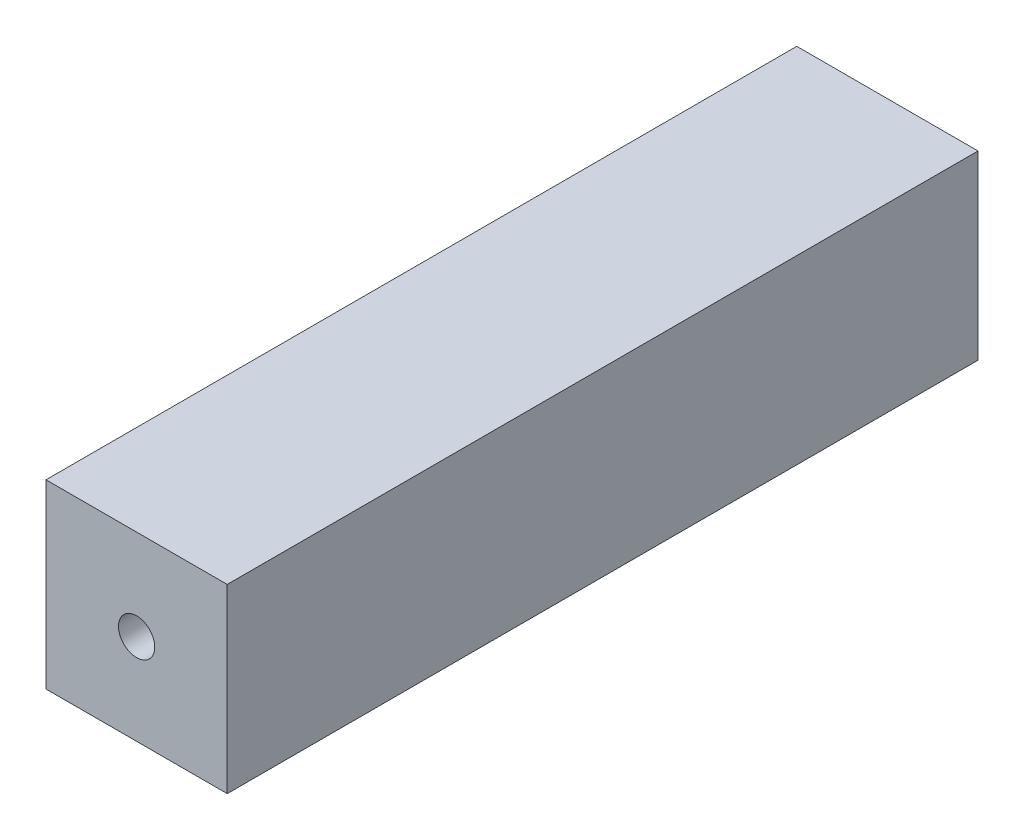
ISO-10303-21;
HEADER;
FILE_DESCRIPTION(('STEP AP214'),'2;1');
FILE_NAME('part.step','',(''),(''),'','','');
FILE_SCHEMA(('AUTOMOTIVE_DESIGN { 1 0 10303 214 1 1 1 1 }'));
ENDSEC;
DATA;
#1=APPLICATION_CONTEXT('core data for automotive mechanical design processes');
#2=APPLICATION_PROTOCOL_DEFINITION('international standard','automotive_design',2000,#1);
#3=PRODUCT_CONTEXT('',#1,'mechanical');
#4=PRODUCT('Part','Part','',(#3));
#5=PRODUCT_RELATED_PRODUCT_CATEGORY('part','',(#4));
#6=PRODUCT_DEFINITION_FORMATION('','',#4);
#7=PRODUCT_DEFINITION_CONTEXT('part definition',#1,'design');
#8=PRODUCT_DEFINITION('design','',#6,#7);
#9=PRODUCT_DEFINITION_SHAPE('','',#8);
#10=(LENGTH_UNIT() NAMED_UNIT(*) SI_UNIT(.MILLI.,.METRE.));
#11=(NAMED_UNIT(*) PLANE_ANGLE_UNIT() SI_UNIT($,.RADIAN.));
#12=(NAMED_UNIT(*) SI_UNIT($,.STERADIAN.) SOLID_ANGLE_UNIT());
#13=UNCERTAINTY_MEASURE_WITH_UNIT(LENGTH_MEASURE(1.E-05),#10,'distance_accuracy_value','');
#14=(GEOMETRIC_REPRESENTATION_CONTEXT(3) GLOBAL_UNCERTAINTY_ASSIGNED_CONTEXT((#13)) GLOBAL_UNIT_ASSIGNED_CONTEXT((#10,
#11,#12)) REPRESENTATION_CONTEXT('',''));
#15=CARTESIAN_POINT('',(0.,0.,0.));
#16=DIRECTION('',(0.,0.,1.));
#17=DIRECTION('',(1.,0.,0.));
#18=AXIS2_PLACEMENT_3D('',#15,#16,#17);
#19=CARTESIAN_POINT('',(-150.,97.,181.3));
#20=DIRECTION('',(0.,0.,1.));
#21=DIRECTION('',(1.,0.,0.));
#22=AXIS2_PLACEMENT_3D('',#19,#20,#21);
#23=CYLINDRICAL_SURFACE('',#22,1.4);
#24=DIRECTION('',(0.,0.,1.));
#25=VECTOR('',#24,1.);
#26=CARTESIAN_POINT('',(-148.6,97.,181.3));
#27=LINE('',#26,#25);
#28=CARTESIAN_POINT('',(-148.6,97.,181.5));
#29=VERTEX_POINT('',#28);
#30=CARTESIAN_POINT('',(-148.6,97.,239.5));
#31=VERTEX_POINT('',#30);
#32=EDGE_CURVE('E9',#29,#31,#27,.T.);
#33=ORIENTED_EDGE('',*,*,#32,.F.);
#34=CARTESIAN_POINT('',(-150.,97.,181.5));
#35=DIRECTION('',(0.,0.,1.));
#36=DIRECTION('',(1.,0.,0.));
#37=AXIS2_PLACEMENT_3D('',#34,#35,#36);
#38=CIRCLE('',#37,1.4);
#39=EDGE_CURVE('E25',#29,#29,#38,.T.);
#40=ORIENTED_EDGE('',*,*,#39,.F.);
#41=ORIENTED_EDGE('',*,*,#32,.T.);
#42=CARTESIAN_POINT('',(-150.,97.,239.5));
#43=DIRECTION('',(0.,0.,1.));
#44=DIRECTION('',(1.,0.,0.));
#45=AXIS2_PLACEMENT_3D('',#42,#43,#44);
#46=CIRCLE('',#45,1.4);
#47=EDGE_CURVE('E122',#31,#31,#46,.T.);
#48=ORIENTED_EDGE('',*,*,#47,.T.);
#49=EDGE_LOOP('',(#33,#40,#41,#48));
#50=FACE_BOUND('',#49,.T.);
#51=ADVANCED_FACE('F14',(#50),#23,.F.);
#52=CARTESIAN_POINT('',(-143.,90.,181.5));
#53=DIRECTION('',(1.,0.,0.));
#54=DIRECTION('',(0.,1.,0.));
#55=AXIS2_PLACEMENT_3D('',#52,#53,#54);
#56=PLANE('',#55);
#57=DIRECTION('',(0.,0.,1.));
#58=VECTOR('',#57,1.);
#59=CARTESIAN_POINT('',(-143.,90.,181.5));
#60=LINE('',#59,#58);
#61=CARTESIAN_POINT('',(-143.,90.,181.5));
#62=VERTEX_POINT('',#61);
#63=CARTESIAN_POINT('',(-143.,90.,239.5));
#64=VERTEX_POINT('',#63);
#65=EDGE_CURVE('E102',#62,#64,#60,.T.);
#66=ORIENTED_EDGE('',*,*,#65,.F.);
#67=DIRECTION('',(0.,1.,0.));
#68=VECTOR('',#67,1.);
#69=CARTESIAN_POINT('',(-143.,90.,181.5));
#70=LINE('',#69,#68);
#71=CARTESIAN_POINT('',(-143.,104.,181.5));
#72=VERTEX_POINT('',#71);
#73=EDGE_CURVE('E127',#62,#72,#70,.T.);
#74=ORIENTED_EDGE('',*,*,#73,.T.);
#75=DIRECTION('',(0.,0.,1.));
#76=VECTOR('',#75,1.);
#77=CARTESIAN_POINT('',(-143.,104.,181.5));
#78=LINE('',#77,#76);
#79=CARTESIAN_POINT('',(-143.,104.,239.5));
#80=VERTEX_POINT('',#79);
#81=EDGE_CURVE('E59',#72,#80,#78,.T.);
#82=ORIENTED_EDGE('',*,*,#81,.T.);
#83=DIRECTION('',(0.,1.,0.));
#84=VECTOR('',#83,1.);
#85=CARTESIAN_POINT('',(-143.,90.,239.5));
#86=LINE('',#85,#84);
#87=EDGE_CURVE('E68',#64,#80,#86,.T.);
#88=ORIENTED_EDGE('',*,*,#87,.F.);
#89=EDGE_LOOP('',(#66,#74,#82,#88));
#90=FACE_BOUND('',#89,.T.);
#91=ADVANCED_FACE('F140',(#90),#56,.T.);
#92=CARTESIAN_POINT('',(-157.,90.,181.5));
#93=DIRECTION('',(0.,0.,1.));
#94=DIRECTION('',(1.,0.,0.));
#95=AXIS2_PLACEMENT_3D('',#92,#93,#94);
#96=PLANE('',#95);
#97=ORIENTED_EDGE('',*,*,#39,.T.);
#98=EDGE_LOOP('',(#97));
#99=FACE_BOUND('',#98,.T.);
#100=DIRECTION('',(1.,0.,0.));
#101=VECTOR('',#100,1.);
#102=CARTESIAN_POINT('',(-157.,104.,181.5));
#103=LINE('',#102,#101);
#104=CARTESIAN_POINT('',(-157.,104.,181.5));
#105=VERTEX_POINT('',#104);
#106=EDGE_CURVE('E87',#105,#72,#103,.T.);
#107=ORIENTED_EDGE('',*,*,#106,.T.);
#108=ORIENTED_EDGE('',*,*,#73,.F.);
#109=DIRECTION('',(1.,0.,0.));
#110=VECTOR('',#109,1.);
#111=CARTESIAN_POINT('',(-157.,90.,181.5));
#112=LINE('',#111,#110);
#113=CARTESIAN_POINT('',(-157.,90.,181.5));
#114=VERTEX_POINT('',#113);
#115=EDGE_CURVE('E78',#114,#62,#112,.T.);
#116=ORIENTED_EDGE('',*,*,#115,.F.);
#117=DIRECTION('',(0.,1.,0.));
#118=VECTOR('',#117,1.);
#119=CARTESIAN_POINT('',(-157.,90.,181.5));
#120=LINE('',#119,#118);
#121=EDGE_CURVE('E109',#114,#105,#120,.T.);
#122=ORIENTED_EDGE('',*,*,#121,.T.);
#123=EDGE_LOOP('',(#107,#108,#116,#122));
#124=FACE_BOUND('',#123,.T.);
#125=ADVANCED_FACE('F142',(#99,#124),#96,.F.);
#126=CARTESIAN_POINT('',(-157.,104.,181.5));
#127=DIRECTION('',(0.,1.,0.));
#128=DIRECTION('',(1.,0.,0.));
#129=AXIS2_PLACEMENT_3D('',#126,#127,#128);
#130=PLANE('',#129);
#131=ORIENTED_EDGE('',*,*,#106,.F.);
#132=DIRECTION('',(0.,0.,1.));
#133=VECTOR('',#132,1.);
#134=CARTESIAN_POINT('',(-157.,104.,181.5));
#135=LINE('',#134,#133);
#136=CARTESIAN_POINT('',(-157.,104.,239.5));
#137=VERTEX_POINT('',#136);
#138=EDGE_CURVE('E114',#105,#137,#135,.T.);
#139=ORIENTED_EDGE('',*,*,#138,.T.);
#140=DIRECTION('',(1.,0.,0.));
#141=VECTOR('',#140,1.);
#142=CARTESIAN_POINT('',(-157.,104.,239.5));
#143=LINE('',#142,#141);
#144=EDGE_CURVE('E18',#137,#80,#143,.T.);
#145=ORIENTED_EDGE('',*,*,#144,.T.);
#146=ORIENTED_EDGE('',*,*,#81,.F.);
#147=EDGE_LOOP('',(#131,#139,#145,#146));
#148=FACE_BOUND('',#147,.T.);
#149=ADVANCED_FACE('F141',(#148),#130,.T.);
#150=CARTESIAN_POINT('',(-157.,90.,239.5));
#151=DIRECTION('',(0.,0.,1.));
#152=DIRECTION('',(1.,0.,0.));
#153=AXIS2_PLACEMENT_3D('',#150,#151,#152);
#154=PLANE('',#153);
#155=ORIENTED_EDGE('',*,*,#47,.F.);
#156=EDGE_LOOP('',(#155));
#157=FACE_BOUND('',#156,.T.);
#158=DIRECTION('',(0.,1.,0.));
#159=VECTOR('',#158,1.);
#160=CARTESIAN_POINT('',(-157.,90.,239.5));
#161=LINE('',#160,#159);
#162=CARTESIAN_POINT('',(-157.,90.,239.5));
#163=VERTEX_POINT('',#162);
#164=EDGE_CURVE('E108',#163,#137,#161,.T.);
#165=ORIENTED_EDGE('',*,*,#164,.F.);
#166=DIRECTION('',(1.,0.,0.));
#167=VECTOR('',#166,1.);
#168=CARTESIAN_POINT('',(-157.,90.,239.5));
#169=LINE('',#168,#167);
#170=EDGE_CURVE('E97',#163,#64,#169,.T.);
#171=ORIENTED_EDGE('',*,*,#170,.T.);
#172=ORIENTED_EDGE('',*,*,#87,.T.);
#173=ORIENTED_EDGE('',*,*,#144,.F.);
#174=EDGE_LOOP('',(#165,#171,#172,#173));
#175=FACE_BOUND('',#174,.T.);
#176=ADVANCED_FACE('F112',(#157,#175),#154,.T.);
#177=CARTESIAN_POINT('',(-157.,90.,181.5));
#178=DIRECTION('',(0.,1.,0.));
#179=DIRECTION('',(1.,0.,0.));
#180=AXIS2_PLACEMENT_3D('',#177,#178,#179);
#181=PLANE('',#180);
#182=ORIENTED_EDGE('',*,*,#65,.T.);
#183=ORIENTED_EDGE('',*,*,#170,.F.);
#184=DIRECTION('',(0.,0.,1.));
#185=VECTOR('',#184,1.);
#186=CARTESIAN_POINT('',(-157.,90.,181.5));
#187=LINE('',#186,#185);
#188=EDGE_CURVE('E100',#114,#163,#187,.T.);
#189=ORIENTED_EDGE('',*,*,#188,.F.);
#190=ORIENTED_EDGE('',*,*,#115,.T.);
#191=EDGE_LOOP('',(#182,#183,#189,#190));
#192=FACE_BOUND('',#191,.T.);
#193=ADVANCED_FACE('F99',(#192),#181,.F.);
#194=CARTESIAN_POINT('',(-157.,90.,181.5));
#195=DIRECTION('',(1.,0.,0.));
#196=DIRECTION('',(0.,1.,0.));
#197=AXIS2_PLACEMENT_3D('',#194,#195,#196);
#198=PLANE('',#197);
#199=ORIENTED_EDGE('',*,*,#164,.T.);
#200=ORIENTED_EDGE('',*,*,#138,.F.);
#201=ORIENTED_EDGE('',*,*,#121,.F.);
#202=ORIENTED_EDGE('',*,*,#188,.T.);
#203=EDGE_LOOP('',(#199,#200,#201,#202));
#204=FACE_BOUND('',#203,.T.);
#205=ADVANCED_FACE('F16',(#204),#198,.F.);
#206=CLOSED_SHELL('',(#51,#91,#125,#149,#176,#193,#205));
#207=MANIFOLD_SOLID_BREP('B1',#206);
#208=ADVANCED_BREP_SHAPE_REPRESENTATION('',(#18,#207),#14);
#209=SHAPE_DEFINITION_REPRESENTATION(#9,#208);
ENDSEC;
END-ISO-10303-21;
